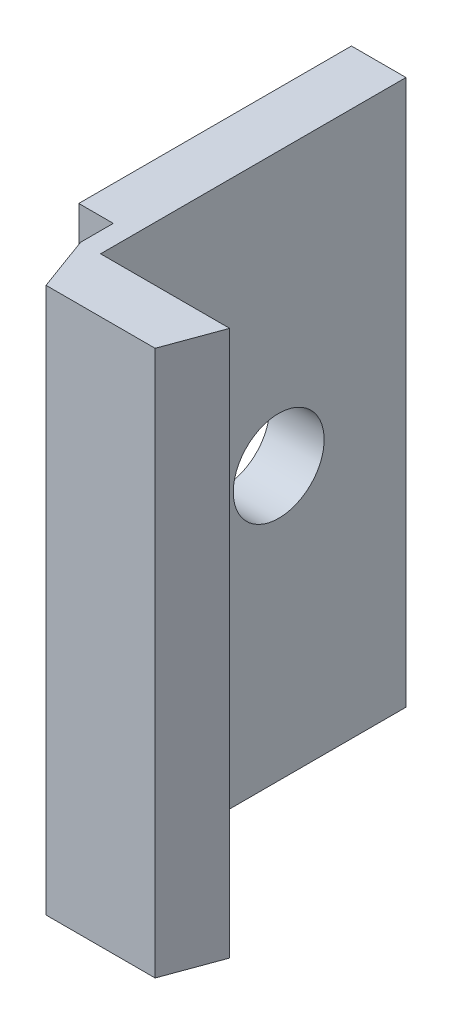
ISO-10303-21;
HEADER;
FILE_DESCRIPTION(('STEP AP214'),'2;1');
FILE_NAME('part.step','',(''),(''),'','','');
FILE_SCHEMA(('AUTOMOTIVE_DESIGN { 1 0 10303 214 1 1 1 1 }'));
ENDSEC;
DATA;
#1=APPLICATION_CONTEXT('core data for automotive mechanical design processes');
#2=APPLICATION_PROTOCOL_DEFINITION('international standard','automotive_design',2000,#1);
#3=PRODUCT_CONTEXT('',#1,'mechanical');
#4=PRODUCT('Part','Part','',(#3));
#5=PRODUCT_RELATED_PRODUCT_CATEGORY('part','',(#4));
#6=PRODUCT_DEFINITION_FORMATION('','',#4);
#7=PRODUCT_DEFINITION_CONTEXT('part definition',#1,'design');
#8=PRODUCT_DEFINITION('design','',#6,#7);
#9=PRODUCT_DEFINITION_SHAPE('','',#8);
#10=(LENGTH_UNIT() NAMED_UNIT(*) SI_UNIT(.MILLI.,.METRE.));
#11=(NAMED_UNIT(*) PLANE_ANGLE_UNIT() SI_UNIT($,.RADIAN.));
#12=(NAMED_UNIT(*) SI_UNIT($,.STERADIAN.) SOLID_ANGLE_UNIT());
#13=UNCERTAINTY_MEASURE_WITH_UNIT(LENGTH_MEASURE(1.E-05),#10,'distance_accuracy_value','');
#14=(GEOMETRIC_REPRESENTATION_CONTEXT(3) GLOBAL_UNCERTAINTY_ASSIGNED_CONTEXT((#13)) GLOBAL_UNIT_ASSIGNED_CONTEXT((#10,
#11,#12)) REPRESENTATION_CONTEXT('',''));
#15=CARTESIAN_POINT('',(0.,0.,0.));
#16=DIRECTION('',(0.,0.,1.));
#17=DIRECTION('',(1.,0.,0.));
#18=AXIS2_PLACEMENT_3D('',#15,#16,#17);
#19=CARTESIAN_POINT('',(-1.9,30.,0.));
#20=DIRECTION('',(1.,0.,0.));
#21=DIRECTION('',(0.,0.,-1.));
#22=AXIS2_PLACEMENT_3D('',#19,#20,#21);
#23=PLANE('',#22);
#24=CARTESIAN_POINT('',(-1.9,15.,-9.8));
#25=DIRECTION('',(1.,0.,0.));
#26=DIRECTION('',(0.,0.,-1.));
#27=AXIS2_PLACEMENT_3D('',#24,#25,#26);
#28=CIRCLE('',#27,2.5);
#29=CARTESIAN_POINT('',(-1.9,15.,-12.3));
#30=VERTEX_POINT('',#29);
#31=EDGE_CURVE('E151',#30,#30,#28,.T.);
#32=ORIENTED_EDGE('',*,*,#31,.T.);
#33=EDGE_LOOP('',(#32));
#34=FACE_BOUND('',#33,.T.);
#35=DIRECTION('',(0.,0.,1.));
#36=VECTOR('',#35,1.);
#37=CARTESIAN_POINT('',(-1.9,0.,0.));
#38=LINE('',#37,#36);
#39=CARTESIAN_POINT('',(-1.9,0.,-16.8));
#40=VERTEX_POINT('',#39);
#41=CARTESIAN_POINT('',(-1.9,0.,-1.8));
#42=VERTEX_POINT('',#41);
#43=EDGE_CURVE('E147',#40,#42,#38,.T.);
#44=ORIENTED_EDGE('',*,*,#43,.T.);
#45=DIRECTION('',(0.,-1.,0.));
#46=VECTOR('',#45,1.);
#47=CARTESIAN_POINT('',(-1.9,30.,-1.8));
#48=LINE('',#47,#46);
#49=CARTESIAN_POINT('',(-1.9,30.,-1.8));
#50=VERTEX_POINT('',#49);
#51=EDGE_CURVE('E11',#50,#42,#48,.T.);
#52=ORIENTED_EDGE('',*,*,#51,.F.);
#53=DIRECTION('',(0.,0.,1.));
#54=VECTOR('',#53,1.);
#55=CARTESIAN_POINT('',(-1.9,30.,0.));
#56=LINE('',#55,#54);
#57=CARTESIAN_POINT('',(-1.9,30.,-16.8));
#58=VERTEX_POINT('',#57);
#59=EDGE_CURVE('E167',#58,#50,#56,.T.);
#60=ORIENTED_EDGE('',*,*,#59,.F.);
#61=DIRECTION('',(0.,-1.,0.));
#62=VECTOR('',#61,1.);
#63=CARTESIAN_POINT('',(-1.9,30.,-16.8));
#64=LINE('',#63,#62);
#65=EDGE_CURVE('E146',#58,#40,#64,.T.);
#66=ORIENTED_EDGE('',*,*,#65,.T.);
#67=EDGE_LOOP('',(#44,#52,#60,#66));
#68=FACE_BOUND('',#67,.T.);
#69=ADVANCED_FACE('F43',(#34,#68),#23,.F.);
#70=CARTESIAN_POINT('',(0.,30.,-1.8));
#71=DIRECTION('',(0.,0.,-1.));
#72=DIRECTION('',(-1.,0.,0.));
#73=AXIS2_PLACEMENT_3D('',#70,#71,#72);
#74=PLANE('',#73);
#75=DIRECTION('',(1.,0.,0.));
#76=VECTOR('',#75,1.);
#77=CARTESIAN_POINT('',(0.,0.,-1.8));
#78=LINE('',#77,#76);
#79=CARTESIAN_POINT('',(0.,0.,-1.8));
#80=VERTEX_POINT('',#79);
#81=EDGE_CURVE('E150',#42,#80,#78,.T.);
#82=ORIENTED_EDGE('',*,*,#81,.T.);
#83=DIRECTION('',(0.,-1.,0.));
#84=VECTOR('',#83,1.);
#85=CARTESIAN_POINT('',(0.,30.,-1.8));
#86=LINE('',#85,#84);
#87=CARTESIAN_POINT('',(0.,30.,-1.8));
#88=VERTEX_POINT('',#87);
#89=EDGE_CURVE('E52',#88,#80,#86,.T.);
#90=ORIENTED_EDGE('',*,*,#89,.F.);
#91=DIRECTION('',(1.,0.,0.));
#92=VECTOR('',#91,1.);
#93=CARTESIAN_POINT('',(0.,30.,-1.8));
#94=LINE('',#93,#92);
#95=EDGE_CURVE('E105',#50,#88,#94,.T.);
#96=ORIENTED_EDGE('',*,*,#95,.F.);
#97=ORIENTED_EDGE('',*,*,#51,.T.);
#98=EDGE_LOOP('',(#82,#90,#96,#97));
#99=FACE_BOUND('',#98,.T.);
#100=ADVANCED_FACE('F185',(#99),#74,.F.);
#101=CARTESIAN_POINT('',(0.,30.,0.));
#102=DIRECTION('',(-1.,0.,0.));
#103=DIRECTION('',(0.,0.,1.));
#104=AXIS2_PLACEMENT_3D('',#101,#102,#103);
#105=PLANE('',#104);
#106=DIRECTION('',(0.,0.,-1.));
#107=VECTOR('',#106,1.);
#108=CARTESIAN_POINT('',(0.,0.,0.));
#109=LINE('',#108,#107);
#110=CARTESIAN_POINT('',(0.,0.,0.));
#111=VERTEX_POINT('',#110);
#112=EDGE_CURVE('E154',#111,#80,#109,.T.);
#113=ORIENTED_EDGE('',*,*,#112,.F.);
#114=DIRECTION('',(0.,-1.,0.));
#115=VECTOR('',#114,1.);
#116=CARTESIAN_POINT('',(0.,30.,0.));
#117=LINE('',#116,#115);
#118=CARTESIAN_POINT('',(0.,30.,0.));
#119=VERTEX_POINT('',#118);
#120=EDGE_CURVE('E177',#119,#111,#117,.T.);
#121=ORIENTED_EDGE('',*,*,#120,.F.);
#122=DIRECTION('',(0.,0.,-1.));
#123=VECTOR('',#122,1.);
#124=CARTESIAN_POINT('',(0.,30.,0.));
#125=LINE('',#124,#123);
#126=EDGE_CURVE('E184',#119,#88,#125,.T.);
#127=ORIENTED_EDGE('',*,*,#126,.T.);
#128=ORIENTED_EDGE('',*,*,#89,.T.);
#129=EDGE_LOOP('',(#113,#121,#127,#128));
#130=FACE_BOUND('',#129,.T.);
#131=ADVANCED_FACE('F182',(#130),#105,.T.);
#132=CARTESIAN_POINT('',(0.,30.,0.));
#133=DIRECTION('',(0.938876315886609,0.,-0.344254649158423));
#134=DIRECTION('',(-0.344254649158423,0.,-0.938876315886609));
#135=AXIS2_PLACEMENT_3D('',#132,#133,#134);
#136=PLANE('',#135);
#137=DIRECTION('',(0.344254649158423,0.,0.938876315886609));
#138=VECTOR('',#137,1.);
#139=CARTESIAN_POINT('',(0.,0.,0.));
#140=LINE('',#139,#138);
#141=CARTESIAN_POINT('',(1.1,0.,3.));
#142=VERTEX_POINT('',#141);
#143=EDGE_CURVE('E157',#111,#142,#140,.T.);
#144=ORIENTED_EDGE('',*,*,#143,.T.);
#145=DIRECTION('',(0.,-1.,0.));
#146=VECTOR('',#145,1.);
#147=CARTESIAN_POINT('',(1.1,30.,3.));
#148=LINE('',#147,#146);
#149=CARTESIAN_POINT('',(1.1,30.,3.));
#150=VERTEX_POINT('',#149);
#151=EDGE_CURVE('E174',#150,#142,#148,.T.);
#152=ORIENTED_EDGE('',*,*,#151,.F.);
#153=DIRECTION('',(0.344254649158423,0.,0.938876315886609));
#154=VECTOR('',#153,1.);
#155=CARTESIAN_POINT('',(0.,30.,0.));
#156=LINE('',#155,#154);
#157=EDGE_CURVE('E201',#119,#150,#156,.T.);
#158=ORIENTED_EDGE('',*,*,#157,.F.);
#159=ORIENTED_EDGE('',*,*,#120,.T.);
#160=EDGE_LOOP('',(#144,#152,#158,#159));
#161=FACE_BOUND('',#160,.T.);
#162=ADVANCED_FACE('F195',(#161),#136,.F.);
#163=CARTESIAN_POINT('',(0.,30.,3.));
#164=DIRECTION('',(0.,0.,-1.));
#165=DIRECTION('',(-1.,0.,0.));
#166=AXIS2_PLACEMENT_3D('',#163,#164,#165);
#167=PLANE('',#166);
#168=DIRECTION('',(1.,0.,0.));
#169=VECTOR('',#168,1.);
#170=CARTESIAN_POINT('',(0.,0.,3.));
#171=LINE('',#170,#169);
#172=CARTESIAN_POINT('',(7.1,0.,3.));
#173=VERTEX_POINT('',#172);
#174=EDGE_CURVE('E159',#142,#173,#171,.T.);
#175=ORIENTED_EDGE('',*,*,#174,.T.);
#176=DIRECTION('',(0.,-1.,0.));
#177=VECTOR('',#176,1.);
#178=CARTESIAN_POINT('',(7.1,30.,3.));
#179=LINE('',#178,#177);
#180=CARTESIAN_POINT('',(7.1,30.,3.));
#181=VERTEX_POINT('',#180);
#182=EDGE_CURVE('E171',#181,#173,#179,.T.);
#183=ORIENTED_EDGE('',*,*,#182,.F.);
#184=DIRECTION('',(1.,0.,0.));
#185=VECTOR('',#184,1.);
#186=CARTESIAN_POINT('',(0.,30.,3.));
#187=LINE('',#186,#185);
#188=EDGE_CURVE('E141',#150,#181,#187,.T.);
#189=ORIENTED_EDGE('',*,*,#188,.F.);
#190=ORIENTED_EDGE('',*,*,#151,.T.);
#191=EDGE_LOOP('',(#175,#183,#189,#190));
#192=FACE_BOUND('',#191,.T.);
#193=ADVANCED_FACE('F199',(#192),#167,.F.);
#194=CARTESIAN_POINT('',(7.22820763956905,30.,2.65034280117532));
#195=DIRECTION('',(-0.938876315886609,0.,-0.344254649158423));
#196=DIRECTION('',(-0.344254649158423,0.,0.938876315886609));
#197=AXIS2_PLACEMENT_3D('',#194,#195,#196);
#198=PLANE('',#197);
#199=DIRECTION('',(0.344254649158423,0.,-0.938876315886609));
#200=VECTOR('',#199,1.);
#201=CARTESIAN_POINT('',(7.22820763956905,0.,2.65034280117532));
#202=LINE('',#201,#200);
#203=CARTESIAN_POINT('',(8.2,0.,0.));
#204=VERTEX_POINT('',#203);
#205=EDGE_CURVE('E161',#173,#204,#202,.T.);
#206=ORIENTED_EDGE('',*,*,#205,.T.);
#207=DIRECTION('',(0.,-1.,0.));
#208=VECTOR('',#207,1.);
#209=CARTESIAN_POINT('',(8.2,30.,0.));
#210=LINE('',#209,#208);
#211=CARTESIAN_POINT('',(8.2,30.,0.));
#212=VERTEX_POINT('',#211);
#213=EDGE_CURVE('E130',#212,#204,#210,.T.);
#214=ORIENTED_EDGE('',*,*,#213,.F.);
#215=DIRECTION('',(0.344254649158423,0.,-0.938876315886609));
#216=VECTOR('',#215,1.);
#217=CARTESIAN_POINT('',(7.22820763956905,30.,2.65034280117532));
#218=LINE('',#217,#216);
#219=EDGE_CURVE('E138',#181,#212,#218,.T.);
#220=ORIENTED_EDGE('',*,*,#219,.F.);
#221=ORIENTED_EDGE('',*,*,#182,.T.);
#222=EDGE_LOOP('',(#206,#214,#220,#221));
#223=FACE_BOUND('',#222,.T.);
#224=ADVANCED_FACE('F231',(#223),#198,.F.);
#225=CARTESIAN_POINT('',(0.,30.,0.));
#226=DIRECTION('',(0.,0.,-1.));
#227=DIRECTION('',(-1.,0.,0.));
#228=AXIS2_PLACEMENT_3D('',#225,#226,#227);
#229=PLANE('',#228);
#230=DIRECTION('',(1.,0.,0.));
#231=VECTOR('',#230,1.);
#232=CARTESIAN_POINT('',(0.,0.,0.));
#233=LINE('',#232,#231);
#234=CARTESIAN_POINT('',(1.1,0.,0.));
#235=VERTEX_POINT('',#234);
#236=EDGE_CURVE('E129',#235,#204,#233,.T.);
#237=ORIENTED_EDGE('',*,*,#236,.F.);
#238=DIRECTION('',(0.,-1.,0.));
#239=VECTOR('',#238,1.);
#240=CARTESIAN_POINT('',(1.1,30.,0.));
#241=LINE('',#240,#239);
#242=CARTESIAN_POINT('',(1.1,30.,0.));
#243=VERTEX_POINT('',#242);
#244=EDGE_CURVE('E123',#243,#235,#241,.T.);
#245=ORIENTED_EDGE('',*,*,#244,.F.);
#246=DIRECTION('',(1.,0.,0.));
#247=VECTOR('',#246,1.);
#248=CARTESIAN_POINT('',(0.,30.,0.));
#249=LINE('',#248,#247);
#250=EDGE_CURVE('E127',#243,#212,#249,.T.);
#251=ORIENTED_EDGE('',*,*,#250,.T.);
#252=ORIENTED_EDGE('',*,*,#213,.T.);
#253=EDGE_LOOP('',(#237,#245,#251,#252));
#254=FACE_BOUND('',#253,.T.);
#255=ADVANCED_FACE('F125',(#254),#229,.T.);
#256=CARTESIAN_POINT('',(1.1,30.,0.));
#257=DIRECTION('',(-1.,0.,0.));
#258=DIRECTION('',(0.,0.,1.));
#259=AXIS2_PLACEMENT_3D('',#256,#257,#258);
#260=PLANE('',#259);
#261=CARTESIAN_POINT('',(1.1,15.,-9.8));
#262=DIRECTION('',(-1.,0.,0.));
#263=DIRECTION('',(0.,0.,1.));
#264=AXIS2_PLACEMENT_3D('',#261,#262,#263);
#265=CIRCLE('',#264,2.5);
#266=CARTESIAN_POINT('',(1.1,15.,-7.3));
#267=VERTEX_POINT('',#266);
#268=EDGE_CURVE('E46',#267,#267,#265,.T.);
#269=ORIENTED_EDGE('',*,*,#268,.T.);
#270=EDGE_LOOP('',(#269));
#271=FACE_BOUND('',#270,.T.);
#272=DIRECTION('',(0.,0.,-1.));
#273=VECTOR('',#272,1.);
#274=CARTESIAN_POINT('',(1.1,0.,0.));
#275=LINE('',#274,#273);
#276=CARTESIAN_POINT('',(1.1,0.,-16.8));
#277=VERTEX_POINT('',#276);
#278=EDGE_CURVE('E91',#235,#277,#275,.T.);
#279=ORIENTED_EDGE('',*,*,#278,.T.);
#280=DIRECTION('',(0.,-1.,0.));
#281=VECTOR('',#280,1.);
#282=CARTESIAN_POINT('',(1.1,30.,-16.8));
#283=LINE('',#282,#281);
#284=CARTESIAN_POINT('',(1.1,30.,-16.8));
#285=VERTEX_POINT('',#284);
#286=EDGE_CURVE('E131',#285,#277,#283,.T.);
#287=ORIENTED_EDGE('',*,*,#286,.F.);
#288=DIRECTION('',(0.,0.,-1.));
#289=VECTOR('',#288,1.);
#290=CARTESIAN_POINT('',(1.1,30.,0.));
#291=LINE('',#290,#289);
#292=EDGE_CURVE('E133',#243,#285,#291,.T.);
#293=ORIENTED_EDGE('',*,*,#292,.F.);
#294=ORIENTED_EDGE('',*,*,#244,.T.);
#295=EDGE_LOOP('',(#279,#287,#293,#294));
#296=FACE_BOUND('',#295,.T.);
#297=ADVANCED_FACE('F134',(#271,#296),#260,.F.);
#298=CARTESIAN_POINT('',(0.,30.,-16.8));
#299=DIRECTION('',(0.,0.,1.));
#300=DIRECTION('',(1.,0.,0.));
#301=AXIS2_PLACEMENT_3D('',#298,#299,#300);
#302=PLANE('',#301);
#303=DIRECTION('',(-1.,0.,0.));
#304=VECTOR('',#303,1.);
#305=CARTESIAN_POINT('',(0.,0.,-16.8));
#306=LINE('',#305,#304);
#307=EDGE_CURVE('E97',#277,#40,#306,.T.);
#308=ORIENTED_EDGE('',*,*,#307,.T.);
#309=ORIENTED_EDGE('',*,*,#65,.F.);
#310=DIRECTION('',(-1.,0.,0.));
#311=VECTOR('',#310,1.);
#312=CARTESIAN_POINT('',(0.,30.,-16.8));
#313=LINE('',#312,#311);
#314=EDGE_CURVE('E60',#285,#58,#313,.T.);
#315=ORIENTED_EDGE('',*,*,#314,.F.);
#316=ORIENTED_EDGE('',*,*,#286,.T.);
#317=EDGE_LOOP('',(#308,#309,#315,#316));
#318=FACE_BOUND('',#317,.T.);
#319=ADVANCED_FACE('F279',(#318),#302,.F.);
#320=CARTESIAN_POINT('',(0.,30.,0.));
#321=DIRECTION('',(0.,1.,0.));
#322=DIRECTION('',(0.,0.,1.));
#323=AXIS2_PLACEMENT_3D('',#320,#321,#322);
#324=PLANE('',#323);
#325=ORIENTED_EDGE('',*,*,#59,.T.);
#326=ORIENTED_EDGE('',*,*,#95,.T.);
#327=ORIENTED_EDGE('',*,*,#126,.F.);
#328=ORIENTED_EDGE('',*,*,#157,.T.);
#329=ORIENTED_EDGE('',*,*,#188,.T.);
#330=ORIENTED_EDGE('',*,*,#219,.T.);
#331=ORIENTED_EDGE('',*,*,#250,.F.);
#332=ORIENTED_EDGE('',*,*,#292,.T.);
#333=ORIENTED_EDGE('',*,*,#314,.T.);
#334=EDGE_LOOP('',(#325,#326,#327,#328,#329,#330,#331,#332,#333));
#335=FACE_BOUND('',#334,.T.);
#336=ADVANCED_FACE('F136',(#335),#324,.T.);
#337=CARTESIAN_POINT('',(0.,0.,0.));
#338=DIRECTION('',(0.,1.,0.));
#339=DIRECTION('',(0.,0.,1.));
#340=AXIS2_PLACEMENT_3D('',#337,#338,#339);
#341=PLANE('',#340);
#342=ORIENTED_EDGE('',*,*,#43,.F.);
#343=ORIENTED_EDGE('',*,*,#307,.F.);
#344=ORIENTED_EDGE('',*,*,#278,.F.);
#345=ORIENTED_EDGE('',*,*,#236,.T.);
#346=ORIENTED_EDGE('',*,*,#205,.F.);
#347=ORIENTED_EDGE('',*,*,#174,.F.);
#348=ORIENTED_EDGE('',*,*,#143,.F.);
#349=ORIENTED_EDGE('',*,*,#112,.T.);
#350=ORIENTED_EDGE('',*,*,#81,.F.);
#351=EDGE_LOOP('',(#342,#343,#344,#345,#346,#347,#348,#349,#350));
#352=FACE_BOUND('',#351,.T.);
#353=ADVANCED_FACE('F190',(#352),#341,.F.);
#354=CARTESIAN_POINT('',(8.2,15.,-9.8));
#355=DIRECTION('',(-1.,0.,0.));
#356=DIRECTION('',(0.,0.,1.));
#357=AXIS2_PLACEMENT_3D('',#354,#355,#356);
#358=CYLINDRICAL_SURFACE('',#357,2.5);
#359=ORIENTED_EDGE('',*,*,#268,.F.);
#360=EDGE_LOOP('',(#359));
#361=FACE_BOUND('',#360,.T.);
#362=ORIENTED_EDGE('',*,*,#31,.F.);
#363=EDGE_LOOP('',(#362));
#364=FACE_BOUND('',#363,.T.);
#365=ADVANCED_FACE('F214',(#361,#364),#358,.F.);
#366=CLOSED_SHELL('',(#69,#100,#131,#162,#193,#224,#255,#297,#319,#336,#353,#365));
#367=MANIFOLD_SOLID_BREP('B2',#366);
#368=ADVANCED_BREP_SHAPE_REPRESENTATION('',(#18,#367),#14);
#369=SHAPE_DEFINITION_REPRESENTATION(#9,#368);
ENDSEC;
END-ISO-10303-21;
